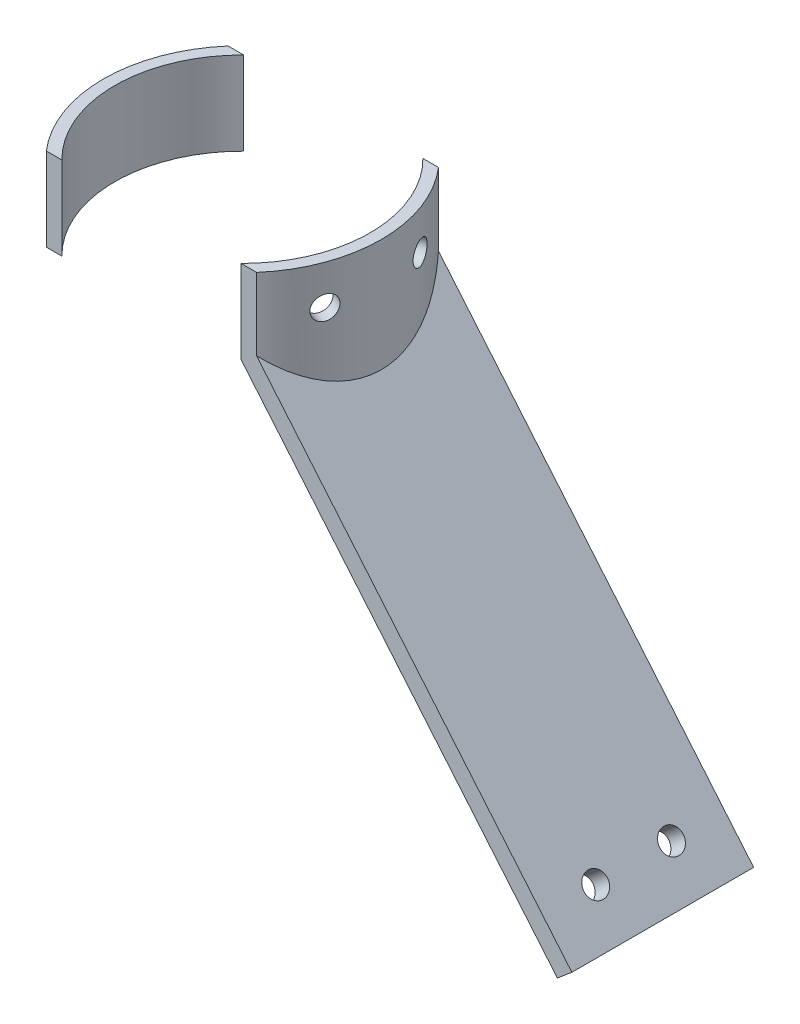
ISO-10303-21;
HEADER;
FILE_DESCRIPTION(('STEP AP214'),'2;1');
FILE_NAME('part.step','',(''),(''),'','','');
FILE_SCHEMA(('AUTOMOTIVE_DESIGN { 1 0 10303 214 1 1 1 1 }'));
ENDSEC;
DATA;
#1=APPLICATION_CONTEXT('core data for automotive mechanical design processes');
#2=APPLICATION_PROTOCOL_DEFINITION('international standard','automotive_design',2000,#1);
#3=PRODUCT_CONTEXT('',#1,'mechanical');
#4=PRODUCT('Part','Part','',(#3));
#5=PRODUCT_RELATED_PRODUCT_CATEGORY('part','',(#4));
#6=PRODUCT_DEFINITION_FORMATION('','',#4);
#7=PRODUCT_DEFINITION_CONTEXT('part definition',#1,'design');
#8=PRODUCT_DEFINITION('design','',#6,#7);
#9=PRODUCT_DEFINITION_SHAPE('','',#8);
#10=(LENGTH_UNIT() NAMED_UNIT(*) SI_UNIT(.MILLI.,.METRE.));
#11=(NAMED_UNIT(*) PLANE_ANGLE_UNIT() SI_UNIT($,.RADIAN.));
#12=(NAMED_UNIT(*) SI_UNIT($,.STERADIAN.) SOLID_ANGLE_UNIT());
#13=UNCERTAINTY_MEASURE_WITH_UNIT(LENGTH_MEASURE(1.E-05),#10,'distance_accuracy_value','');
#14=(GEOMETRIC_REPRESENTATION_CONTEXT(3) GLOBAL_UNCERTAINTY_ASSIGNED_CONTEXT((#13)) GLOBAL_UNIT_ASSIGNED_CONTEXT((#10,
#11,#12)) REPRESENTATION_CONTEXT('',''));
#15=CARTESIAN_POINT('',(0.,0.,0.));
#16=DIRECTION('',(0.,0.,1.));
#17=DIRECTION('',(1.,0.,0.));
#18=AXIS2_PLACEMENT_3D('',#15,#16,#17);
#19=CARTESIAN_POINT('',(0.,2.8,0.));
#20=DIRECTION('',(0.,1.,0.));
#21=DIRECTION('',(0.,0.,1.));
#22=AXIS2_PLACEMENT_3D('',#19,#20,#21);
#23=CYLINDRICAL_SURFACE('',#22,16.85);
#24=DIRECTION('',(0.,1.,0.));
#25=VECTOR('',#24,1.);
#26=CARTESIAN_POINT('',(-11.8288841401038,2.8,-12.));
#27=LINE('',#26,#25);
#28=CARTESIAN_POINT('',(-11.8288841401038,2.8,-12.));
#29=VERTEX_POINT('',#28);
#30=CARTESIAN_POINT('',(-11.8288841401038,13.8,-12.));
#31=VERTEX_POINT('',#30);
#32=EDGE_CURVE('E92',#29,#31,#27,.T.);
#33=ORIENTED_EDGE('',*,*,#32,.T.);
#34=CARTESIAN_POINT('',(0.,13.8,0.));
#35=DIRECTION('',(0.,1.,0.));
#36=DIRECTION('',(0.,0.,1.));
#37=AXIS2_PLACEMENT_3D('',#34,#35,#36);
#38=CIRCLE('',#37,16.85);
#39=CARTESIAN_POINT('',(-11.8288841401038,13.8,12.));
#40=VERTEX_POINT('',#39);
#41=EDGE_CURVE('E12',#31,#40,#38,.T.);
#42=ORIENTED_EDGE('',*,*,#41,.T.);
#43=DIRECTION('',(0.,1.,0.));
#44=VECTOR('',#43,1.);
#45=CARTESIAN_POINT('',(-11.8288841401038,2.8,12.));
#46=LINE('',#45,#44);
#47=CARTESIAN_POINT('',(-11.8288841401038,2.8,12.));
#48=VERTEX_POINT('',#47);
#49=EDGE_CURVE('E63',#48,#40,#46,.T.);
#50=ORIENTED_EDGE('',*,*,#49,.F.);
#51=CARTESIAN_POINT('',(0.,2.8,0.));
#52=DIRECTION('',(0.,1.,0.));
#53=DIRECTION('',(0.,0.,1.));
#54=AXIS2_PLACEMENT_3D('',#51,#52,#53);
#55=CIRCLE('',#54,16.85);
#56=EDGE_CURVE('E104',#29,#48,#55,.T.);
#57=ORIENTED_EDGE('',*,*,#56,.F.);
#58=EDGE_LOOP('',(#33,#42,#50,#57));
#59=FACE_BOUND('',#58,.T.);
#60=ADVANCED_FACE('F48',(#59),#23,.F.);
#61=CARTESIAN_POINT('',(-11.8288841401038,2.8,12.));
#62=DIRECTION('',(0.,0.,-1.));
#63=DIRECTION('',(-1.,0.,0.));
#64=AXIS2_PLACEMENT_3D('',#61,#62,#63);
#65=PLANE('',#64);
#66=ORIENTED_EDGE('',*,*,#49,.T.);
#67=DIRECTION('',(-1.,0.,0.));
#68=VECTOR('',#67,1.);
#69=CARTESIAN_POINT('',(-11.8288841401038,13.8,12.));
#70=LINE('',#69,#68);
#71=CARTESIAN_POINT('',(-13.8824529532788,13.8,12.));
#72=VERTEX_POINT('',#71);
#73=EDGE_CURVE('E56',#40,#72,#70,.T.);
#74=ORIENTED_EDGE('',*,*,#73,.T.);
#75=DIRECTION('',(0.,1.,0.));
#76=VECTOR('',#75,1.);
#77=CARTESIAN_POINT('',(-13.8824529532788,2.8,12.));
#78=LINE('',#77,#76);
#79=CARTESIAN_POINT('',(-13.8824529532788,2.8,12.));
#80=VERTEX_POINT('',#79);
#81=EDGE_CURVE('E71',#80,#72,#78,.T.);
#82=ORIENTED_EDGE('',*,*,#81,.F.);
#83=DIRECTION('',(-1.,0.,0.));
#84=VECTOR('',#83,1.);
#85=CARTESIAN_POINT('',(-11.8288841401038,2.8,12.));
#86=LINE('',#85,#84);
#87=EDGE_CURVE('E106',#48,#80,#86,.T.);
#88=ORIENTED_EDGE('',*,*,#87,.F.);
#89=EDGE_LOOP('',(#66,#74,#82,#88));
#90=FACE_BOUND('',#89,.T.);
#91=ADVANCED_FACE('F118',(#90),#65,.F.);
#92=CARTESIAN_POINT('',(0.,2.8,0.));
#93=DIRECTION('',(0.,1.,0.));
#94=DIRECTION('',(0.,0.,1.));
#95=AXIS2_PLACEMENT_3D('',#92,#93,#94);
#96=CYLINDRICAL_SURFACE('',#95,18.35);
#97=ORIENTED_EDGE('',*,*,#81,.T.);
#98=CARTESIAN_POINT('',(0.,13.8,0.));
#99=DIRECTION('',(0.,1.,0.));
#100=DIRECTION('',(0.,0.,1.));
#101=AXIS2_PLACEMENT_3D('',#98,#99,#100);
#102=CIRCLE('',#101,18.35);
#103=CARTESIAN_POINT('',(-13.8824529532788,13.8,-12.));
#104=VERTEX_POINT('',#103);
#105=EDGE_CURVE('E117',#104,#72,#102,.T.);
#106=ORIENTED_EDGE('',*,*,#105,.F.);
#107=DIRECTION('',(0.,1.,0.));
#108=VECTOR('',#107,1.);
#109=CARTESIAN_POINT('',(-13.8824529532788,2.8,-12.));
#110=LINE('',#109,#108);
#111=CARTESIAN_POINT('',(-13.8824529532788,2.8,-12.));
#112=VERTEX_POINT('',#111);
#113=EDGE_CURVE('E101',#112,#104,#110,.T.);
#114=ORIENTED_EDGE('',*,*,#113,.F.);
#115=CARTESIAN_POINT('',(0.,2.8,0.));
#116=DIRECTION('',(0.,1.,0.));
#117=DIRECTION('',(0.,0.,1.));
#118=AXIS2_PLACEMENT_3D('',#115,#116,#117);
#119=CIRCLE('',#118,18.35);
#120=EDGE_CURVE('E110',#112,#80,#119,.T.);
#121=ORIENTED_EDGE('',*,*,#120,.T.);
#122=EDGE_LOOP('',(#97,#106,#114,#121));
#123=FACE_BOUND('',#122,.T.);
#124=ADVANCED_FACE('F120',(#123),#96,.T.);
#125=CARTESIAN_POINT('',(-11.8288841401038,2.8,-12.));
#126=DIRECTION('',(0.,0.,-1.));
#127=DIRECTION('',(-1.,0.,0.));
#128=AXIS2_PLACEMENT_3D('',#125,#126,#127);
#129=PLANE('',#128);
#130=ORIENTED_EDGE('',*,*,#113,.T.);
#131=DIRECTION('',(-1.,0.,0.));
#132=VECTOR('',#131,1.);
#133=CARTESIAN_POINT('',(-11.8288841401038,13.8,-12.));
#134=LINE('',#133,#132);
#135=EDGE_CURVE('E98',#31,#104,#134,.T.);
#136=ORIENTED_EDGE('',*,*,#135,.F.);
#137=ORIENTED_EDGE('',*,*,#32,.F.);
#138=DIRECTION('',(-1.,0.,0.));
#139=VECTOR('',#138,1.);
#140=CARTESIAN_POINT('',(-11.8288841401038,2.8,-12.));
#141=LINE('',#140,#139);
#142=EDGE_CURVE('E96',#29,#112,#141,.T.);
#143=ORIENTED_EDGE('',*,*,#142,.T.);
#144=EDGE_LOOP('',(#130,#136,#137,#143));
#145=FACE_BOUND('',#144,.T.);
#146=ADVANCED_FACE('F94',(#145),#129,.T.);
#147=CARTESIAN_POINT('',(0.,2.8,0.));
#148=DIRECTION('',(0.,1.,0.));
#149=DIRECTION('',(0.,0.,1.));
#150=AXIS2_PLACEMENT_3D('',#147,#148,#149);
#151=PLANE('',#150);
#152=ORIENTED_EDGE('',*,*,#56,.T.);
#153=ORIENTED_EDGE('',*,*,#87,.T.);
#154=ORIENTED_EDGE('',*,*,#120,.F.);
#155=ORIENTED_EDGE('',*,*,#142,.F.);
#156=EDGE_LOOP('',(#152,#153,#154,#155));
#157=FACE_BOUND('',#156,.T.);
#158=ADVANCED_FACE('F109',(#157),#151,.F.);
#159=CARTESIAN_POINT('',(0.,13.8,0.));
#160=DIRECTION('',(0.,1.,0.));
#161=DIRECTION('',(0.,0.,1.));
#162=AXIS2_PLACEMENT_3D('',#159,#160,#161);
#163=PLANE('',#162);
#164=ORIENTED_EDGE('',*,*,#41,.F.);
#165=ORIENTED_EDGE('',*,*,#135,.T.);
#166=ORIENTED_EDGE('',*,*,#105,.T.);
#167=ORIENTED_EDGE('',*,*,#73,.F.);
#168=EDGE_LOOP('',(#164,#165,#166,#167));
#169=FACE_BOUND('',#168,.T.);
#170=ADVANCED_FACE('F50',(#169),#163,.T.);
#171=CLOSED_SHELL('',(#60,#91,#124,#146,#158,#170));
#172=MANIFOLD_SOLID_BREP('B2_NOT_SHOWN',#171);
#173=CARTESIAN_POINT('',(0.,2.8,0.));
#174=DIRECTION('',(0.,1.,0.));
#175=DIRECTION('',(0.,0.,1.));
#176=AXIS2_PLACEMENT_3D('',#173,#174,#175);
#177=CYLINDRICAL_SURFACE('',#176,16.85);
#178=DIRECTION('',(0.,1.,0.));
#179=VECTOR('',#178,1.);
#180=CARTESIAN_POINT('',(11.8288841401038,2.8,-12.));
#181=LINE('',#180,#179);
#182=CARTESIAN_POINT('',(11.8288841401038,2.8,-12.));
#183=VERTEX_POINT('',#182);
#184=CARTESIAN_POINT('',(11.8288841401038,13.8,-12.));
#185=VERTEX_POINT('',#184);
#186=EDGE_CURVE('E46',#183,#185,#181,.T.);
#187=ORIENTED_EDGE('',*,*,#186,.F.);
#188=CARTESIAN_POINT('',(0.,16.9161808779793,0.));
#189=DIRECTION('',(0.766472000851868,0.642277721791855,0.));
#190=DIRECTION('',(-0.642277721791855,0.766472000851868,0.));
#191=AXIS2_PLACEMENT_3D('',#188,#189,#190);
#192=ELLIPSE('',#191,26.2347570658237,16.85);
#193=CARTESIAN_POINT('',(11.8288841401038,2.8,12.));
#194=VERTEX_POINT('',#193);
#195=EDGE_CURVE('E229',#183,#194,#192,.F.);
#196=ORIENTED_EDGE('',*,*,#195,.T.);
#197=DIRECTION('',(0.,1.,0.));
#198=VECTOR('',#197,1.);
#199=CARTESIAN_POINT('',(11.8288841401038,2.8,12.));
#200=LINE('',#199,#198);
#201=CARTESIAN_POINT('',(11.8288841401038,13.8,12.));
#202=VERTEX_POINT('',#201);
#203=EDGE_CURVE('E234',#194,#202,#200,.T.);
#204=ORIENTED_EDGE('',*,*,#203,.T.);
#205=CARTESIAN_POINT('',(0.,13.8,0.));
#206=DIRECTION('',(0.,1.,0.));
#207=DIRECTION('',(0.,0.,1.));
#208=AXIS2_PLACEMENT_3D('',#205,#206,#207);
#209=CIRCLE('',#208,16.85);
#210=EDGE_CURVE('E318',#202,#185,#209,.T.);
#211=ORIENTED_EDGE('',*,*,#210,.T.);
#212=EDGE_LOOP('',(#187,#196,#204,#211));
#213=FACE_BOUND('',#212,.T.);
#214=CARTESIAN_POINT('',(15.2244260831931,8.6,7.22075830071809));
#215=CARTESIAN_POINT('',(15.2244282672812,8.68685764042173,7.22075507214294));
#216=CARTESIAN_POINT('',(15.2275838402115,8.77377357426321,7.21411201447397));
#217=CARTESIAN_POINT('',(15.2400720108134,8.94519789639456,7.18769158780758));
#218=CARTESIAN_POINT('',(15.249411512842,9.0297034834033,7.16789953787649));
#219=CARTESIAN_POINT('',(15.2738366548366,9.19379940226453,7.11570369449969));
#220=CARTESIAN_POINT('',(15.2889188988741,9.27339260675548,7.08330735426244));
#221=CARTESIAN_POINT('',(15.3241551334922,9.42545551823594,7.00674936291734));
#222=CARTESIAN_POINT('',(15.3443080808927,9.49792668616078,6.96259013164302));
#223=CARTESIAN_POINT('',(15.3888861648403,9.63393822154887,6.86350011211219));
#224=CARTESIAN_POINT('',(15.413323278282,9.69745262658217,6.80853907255129));
#225=CARTESIAN_POINT('',(15.4654228726853,9.81352472045241,6.68935099033785));
#226=CARTESIAN_POINT('',(15.493085500313,9.8660819107552,6.62512352630403));
#227=CARTESIAN_POINT('',(15.5506053147383,9.95884017841085,6.48896281500783));
#228=CARTESIAN_POINT('',(15.5804665780346,9.99901754916391,6.41701513469733));
#229=CARTESIAN_POINT('',(15.6412281860524,10.0657250691206,6.26745474228185));
#230=CARTESIAN_POINT('',(15.672128509321,10.0922554998985,6.18984214709754));
#231=CARTESIAN_POINT('',(15.7338135103264,10.1308426235445,6.03132007004642));
#232=CARTESIAN_POINT('',(15.7645982679686,10.1429400389337,5.95042053326297));
#233=CARTESIAN_POINT('',(15.8251730351182,10.1524424837646,5.78739651330843));
#234=CARTESIAN_POINT('',(15.8549630673501,10.1498478490761,5.70527205818258));
#235=CARTESIAN_POINT('',(15.9126254571186,10.1300732574301,5.54240856480558));
#236=CARTESIAN_POINT('',(15.9405035321067,10.1129390368253,5.46166599125277));
#237=CARTESIAN_POINT('',(15.993778228799,10.0646416546888,5.30363235185331));
#238=CARTESIAN_POINT('',(16.0191748246959,10.0334783472739,5.22634132190712));
#239=CARTESIAN_POINT('',(16.0670173551111,9.95796364802588,5.07736050951955));
#240=CARTESIAN_POINT('',(16.089459238618,9.91359441649133,5.00567847067833));
#241=CARTESIAN_POINT('',(16.1310036466746,9.81294018445009,4.87013903782363));
#242=CARTESIAN_POINT('',(16.1501060896877,9.75665489307182,4.80628183487482));
#243=CARTESIAN_POINT('',(16.184816419517,9.63352077801484,4.68807366928212));
#244=CARTESIAN_POINT('',(16.2004112424264,9.56663399566885,4.63375840412252));
#245=CARTESIAN_POINT('',(16.2278948072455,9.42432772657509,4.5365723835801));
#246=CARTESIAN_POINT('',(16.2397835431455,9.34890822599115,4.49370164675545));
#247=CARTESIAN_POINT('',(16.2598020406441,9.19164153355043,4.42072132312091));
#248=CARTESIAN_POINT('',(16.2679308198675,9.10979266840137,4.39061507149747));
#249=CARTESIAN_POINT('',(16.2804057707325,8.94201052152151,4.344130786106));
#250=CARTESIAN_POINT('',(16.2847520360558,8.8560773410028,4.32775241233915));
#251=CARTESIAN_POINT('',(16.2896501562254,8.68288949426581,4.30927958967893));
#252=CARTESIAN_POINT('',(16.2902153053212,8.59564054021511,4.3071350952608));
#253=CARTESIAN_POINT('',(16.2875863780914,8.42201374659574,4.31706559175274));
#254=CARTESIAN_POINT('',(16.2843923430773,8.33563589746461,4.32914042639972));
#255=CARTESIAN_POINT('',(16.2742555388917,8.16635400686564,4.36709140780127));
#256=CARTESIAN_POINT('',(16.2673192094256,8.08344426083319,4.39294384525489));
#257=CARTESIAN_POINT('',(16.2497139919301,7.92327499987572,4.45762403434126));
#258=CARTESIAN_POINT('',(16.2390450328075,7.84601559260335,4.49645203311142));
#259=CARTESIAN_POINT('',(16.2139800264284,7.69910252466562,4.5860126365565));
#260=CARTESIAN_POINT('',(16.1995736241677,7.62947077194627,4.63677827864595));
#261=CARTESIAN_POINT('',(16.1671446163227,7.50001166074627,4.74861198206451));
#262=CARTESIAN_POINT('',(16.1491219381915,7.44018449900148,4.80968025007301));
#263=CARTESIAN_POINT('',(16.1095875611131,7.33185760509499,4.94048187302096));
#264=CARTESIAN_POINT('',(16.0880659131974,7.28339116484657,5.01023979985773));
#265=CARTESIAN_POINT('',(16.0418798490824,7.19939084777889,5.15620428427038));
#266=CARTESIAN_POINT('',(16.0172154717735,7.16385681094603,5.23241076204347));
#267=CARTESIAN_POINT('',(15.9652451355783,7.10679117032993,5.38889864567805));
#268=CARTESIAN_POINT('',(15.9379434532105,7.08523732077257,5.4691733574452));
#269=CARTESIAN_POINT('',(15.8812898949251,7.05666961334635,5.63156486743939));
#270=CARTESIAN_POINT('',(15.8519380663803,7.04965541962316,5.71368162307241));
#271=CARTESIAN_POINT('',(15.792081658912,7.05036938784146,5.87709124674859));
#272=CARTESIAN_POINT('',(15.761581632166,7.05804433267079,5.95838602026259));
#273=CARTESIAN_POINT('',(15.7002515926462,7.08780625160656,6.11816357531452));
#274=CARTESIAN_POINT('',(15.6694215792279,7.10989325387291,6.19664635135774));
#275=CARTESIAN_POINT('',(15.6084576160425,7.16784149958837,6.34864252720809));
#276=CARTESIAN_POINT('',(15.5783237008364,7.20370342540402,6.42215568062348));
#277=CARTESIAN_POINT('',(15.5198375590157,7.28817722561959,6.56223364886247));
#278=CARTESIAN_POINT('',(15.4914853141662,7.33678896950273,6.62879853480402));
#279=CARTESIAN_POINT('',(15.4375491787496,7.44559125262322,6.75345932616305));
#280=CARTESIAN_POINT('',(15.4119756800651,7.50582306592314,6.81152370488593));
#281=CARTESIAN_POINT('',(15.3647494464856,7.63607680558096,6.91739433296635));
#282=CARTESIAN_POINT('',(15.3430976573798,7.70610108636848,6.96519810831167));
#283=CARTESIAN_POINT('',(15.3046037119646,7.8541128089387,7.04938004501614));
#284=CARTESIAN_POINT('',(15.2877719634385,7.93211699623317,7.08573349865082));
#285=CARTESIAN_POINT('',(15.259744630174,8.09370145284663,7.14589430712018));
#286=CARTESIAN_POINT('',(15.2485426196699,8.17727524101753,7.16971596716537));
#287=CARTESIAN_POINT('',(15.2351095978662,8.31777745610907,7.19819976359607));
#288=CARTESIAN_POINT('',(15.2311113496279,8.37380426440338,7.20664877394122));
#289=CARTESIAN_POINT('',(15.225768883611,8.48654575818663,7.21792908709413));
#290=CARTESIAN_POINT('',(15.2244246564425,8.5432604412411,7.22076040977757));
#291=CARTESIAN_POINT('',(15.2244260831931,8.6,7.22075830071809));
#292=B_SPLINE_CURVE_WITH_KNOTS('',3,(#214,#215,#216,#217,#218,#219,#220,#221,#222,#223,#224,
#225,#226,#227,#228,#229,#230,#231,#232,#233,#234,#235,#236,#237,#238,#239,#240,#241,#242,#243,
#244,#245,#246,#247,#248,#249,#250,#251,#252,#253,#254,#255,#256,#257,#258,#259,#260,#261,#262,
#263,#264,#265,#266,#267,#268,#269,#270,#271,#272,#273,#274,#275,#276,#277,#278,#279,#280,#281,
#282,#283,#284,#285,#286,#287,#288,#289,#290,#291),.UNSPECIFIED.,.T.,.F.,(4,2,2,2,2,2,2,2,2,2,2,
2,2,2,2,2,2,2,2,2,2,2,2,2,2,2,2,2,2,2,2,2,2,2,2,2,2,2,4),(0.,0.260365714642252,0.52102261890889,
0.781525624404935,1.04197508118343,1.30316461678478,1.56436603346214,1.82606457022622,
2.08775770720575,2.34871072173607,2.60965777073196,2.86978700330242,3.12991894092079,
3.39040389458143,3.65089520742494,3.91234120445754,4.17378762544189,4.43530231678541,
4.69681053099423,4.95739880764163,5.2179842205851,5.47812264415891,5.73826602270955,
5.99913800148197,6.26001521418955,6.52164761260898,6.78327677372093,7.04448859312948,
7.30569437868802,7.56595563580761,7.82621740145645,8.08649206132053,8.34676405692056,
8.60797814096131,8.86925513774164,9.13109212070597,9.39262956109941,9.5627134818814,
9.73279680089649),.UNSPECIFIED.);
#293=CARTESIAN_POINT('',(15.2244260831931,8.6,7.22075830071809));
#294=VERTEX_POINT('',#293);
#295=EDGE_CURVE('E266',#294,#294,#292,.T.);
#296=ORIENTED_EDGE('',*,*,#295,.F.);
#297=EDGE_LOOP('',(#296));
#298=FACE_BOUND('',#297,.T.);
#299=CARTESIAN_POINT('',(16.2895902531871,8.6,-4.30949525852744));
#300=CARTESIAN_POINT('',(16.2895898396474,8.68687485213427,-4.30949912832715));
#301=CARTESIAN_POINT('',(16.287712985253,8.77380799662305,-4.31661065111521));
#302=CARTESIAN_POINT('',(16.2802009208052,8.94526676155865,-4.3448548058642));
#303=CARTESIAN_POINT('',(16.2745615104448,9.02978958117154,-4.3660031075626));
#304=CARTESIAN_POINT('',(16.2595319234897,9.19391997965849,-4.42164529445931));
#305=CARTESIAN_POINT('',(16.2501439296771,9.27353038791383,-4.45613141274487));
#306=CARTESIAN_POINT('',(16.2276477361407,9.42562493567571,-4.53736893563135));
#307=CARTESIAN_POINT('',(16.2145403056979,9.49811054461535,-4.58411780381035));
#308=CARTESIAN_POINT('',(16.1846380432556,9.63413336575868,-4.68859713235003));
#309=CARTESIAN_POINT('',(16.1678334854355,9.69764623635131,-4.74635650286123));
#310=CARTESIAN_POINT('',(16.1307074100592,9.8137109754555,-4.87103690844595));
#311=CARTESIAN_POINT('',(16.1103857380967,9.86626236251848,-4.9379583457206));
#312=CARTESIAN_POINT('',(16.0664509936563,9.95899097011073,-5.0790860250181));
#313=CARTESIAN_POINT('',(16.0428325881427,9.99914779536376,-5.15330401177221));
#314=CARTESIAN_POINT('',(15.9927348504119,10.0658159286408,-5.30673513211479));
#315=CARTESIAN_POINT('',(15.9662555787895,10.0923275256101,-5.38594815989058));
#316=CARTESIAN_POINT('',(15.911083667811,10.1308798248977,-5.54681190508084));
#317=CARTESIAN_POINT('',(15.8823975980632,10.1429618350789,-5.62845497491297));
#318=CARTESIAN_POINT('',(15.8234765172783,10.1524409405187,-5.79203304365329));
#319=CARTESIAN_POINT('',(15.7932415397342,10.1498383531799,-5.8739680362134));
#320=CARTESIAN_POINT('',(15.7321947269102,10.1300555807298,-6.03556042824462));
#321=CARTESIAN_POINT('',(15.7013848290229,10.1129178908692,-6.11522376814324));
#322=CARTESIAN_POINT('',(15.6400967130267,10.0646187054545,-6.27031355368401));
#323=CARTESIAN_POINT('',(15.6096184989417,10.0334570399617,-6.34573994797162));
#324=CARTESIAN_POINT('',(15.5500136382739,9.9579406731822,-6.49043257784792));
#325=CARTESIAN_POINT('',(15.5208892778031,9.91356453127814,-6.55968856279635));
#326=CARTESIAN_POINT('',(15.4651391673346,9.81289455878253,-6.69006770669231));
#327=CARTESIAN_POINT('',(15.4385134801821,9.75660042855136,-6.75119066109792));
#328=CARTESIAN_POINT('',(15.3887260368936,9.63344123198333,-6.86392240768664));
#329=CARTESIAN_POINT('',(15.3655776073948,9.56653742024266,-6.91549476437347));
#330=CARTESIAN_POINT('',(15.323837696498,9.42419246865494,-7.00750018327498));
#331=CARTESIAN_POINT('',(15.3052462177587,9.34875132382676,-7.04793323899035));
#332=CARTESIAN_POINT('',(15.2734341798062,9.19145281909122,-7.11661070511637));
#333=CARTESIAN_POINT('',(15.2602139669112,9.10959504587053,-7.14485432960745));
#334=CARTESIAN_POINT('',(15.2397463802147,8.94179430364453,-7.18840834278278));
#335=CARTESIAN_POINT('',(15.2324988472913,8.85585144353721,-7.20371907602091));
#336=CARTESIAN_POINT('',(15.2243279957652,8.68267011724502,-7.2209715147604));
#337=CARTESIAN_POINT('',(15.2233807259162,8.59543782280455,-7.22296385197485));
#338=CARTESIAN_POINT('',(15.2277907446617,8.42184637812954,-7.21366165689065));
#339=CARTESIAN_POINT('',(15.2331479587511,8.33548721758864,-7.20236728161165));
#340=CARTESIAN_POINT('',(15.2499035698212,8.16625318908284,-7.16682091827444));
#341=CARTESIAN_POINT('',(15.2612909658147,8.08337227188709,-7.14259252536582));
#342=CARTESIAN_POINT('',(15.2895851831166,7.92325977681206,-7.08182192803297));
#343=CARTESIAN_POINT('',(15.3064921142665,7.846028311397,-7.04527947855269));
#344=CARTESIAN_POINT('',(15.3451416191757,7.69915442713193,-6.96069601198073));
#345=CARTESIAN_POINT('',(15.3668984404136,7.62953528807432,-6.912621083679));
#346=CARTESIAN_POINT('',(15.4142964663532,7.50009768757522,-6.80627246196407));
#347=CARTESIAN_POINT('',(15.4399377559001,7.44027944026589,-6.74799854577852));
#348=CARTESIAN_POINT('',(15.4941534146465,7.33194855606896,-6.62256626811167));
#349=CARTESIAN_POINT('',(15.522736861891,7.28347251873752,-6.55538021219656));
#350=CARTESIAN_POINT('',(15.5816646974969,7.19945297824665,-6.41405322319526));
#351=CARTESIAN_POINT('',(15.6120090659275,7.16390932874676,-6.33991236882021));
#352=CARTESIAN_POINT('',(15.6733138678587,7.10682141700697,-6.18680184361074));
#353=CARTESIAN_POINT('',(15.704273334434,7.08525673645729,-6.10783940084695));
#354=CARTESIAN_POINT('',(15.7658148344459,7.05667385736885,-5.9471824010183));
#355=CARTESIAN_POINT('',(15.7963968768676,7.04965531187199,-5.8654879091662));
#356=CARTESIAN_POINT('',(15.8561434686138,7.05036944188681,-5.70199625033251));
#357=CARTESIAN_POINT('',(15.8853129202323,7.05804669166649,-5.62020062731963));
#358=CARTESIAN_POINT('',(15.9415841018395,7.0878197626115,-5.45854596003213));
#359=CARTESIAN_POINT('',(15.9686858313388,7.10991558719031,-5.37868691621599));
#360=CARTESIAN_POINT('',(16.0202050676513,7.16788052453857,-5.2232402222843));
#361=CARTESIAN_POINT('',(16.0446232084379,7.20374637522975,-5.14765156538818));
#362=CARTESIAN_POINT('',(16.0903362076972,7.28822764738427,-5.00293380328834));
#363=CARTESIAN_POINT('',(16.1116311019138,7.33684292291923,-4.93380462416248));
#364=CARTESIAN_POINT('',(16.1508668345379,7.44564224372941,-4.80381454142901));
#365=CARTESIAN_POINT('',(16.1687958133781,7.50586573366287,-4.74298307264295));
#366=CARTESIAN_POINT('',(16.2010300255624,7.63609716281863,-4.63168359673742));
#367=CARTESIAN_POINT('',(16.2153343837067,7.70610745883967,-4.5812180931363));
#368=CARTESIAN_POINT('',(16.2402468681767,7.8540938535798,-4.49210795883202));
#369=CARTESIAN_POINT('',(16.2508465741222,7.93208758488942,-4.4534902813087));
#370=CARTESIAN_POINT('',(16.2682563681381,8.09364740987073,-4.38946984918477));
#371=CARTESIAN_POINT('',(16.2750707679594,8.17720704150035,-4.36405206106714));
#372=CARTESIAN_POINT('',(16.2831915197748,8.31770783881584,-4.33362646012958));
#373=CARTESIAN_POINT('',(16.2855904790913,8.37374851532424,-4.32459041539223));
#374=CARTESIAN_POINT('',(16.2887899782511,8.48651783685086,-4.31252356042266));
#375=CARTESIAN_POINT('',(16.289590523344,8.54324647960906,-4.30949273046839));
#376=CARTESIAN_POINT('',(16.2895902531871,8.6,-4.30949525852744));
#377=B_SPLINE_CURVE_WITH_KNOTS('',3,(#299,#300,#301,#302,#303,#304,#305,#306,#307,#308,#309,
#310,#311,#312,#313,#314,#315,#316,#317,#318,#319,#320,#321,#322,#323,#324,#325,#326,#327,#328,
#329,#330,#331,#332,#333,#334,#335,#336,#337,#338,#339,#340,#341,#342,#343,#344,#345,#346,#347,
#348,#349,#350,#351,#352,#353,#354,#355,#356,#357,#358,#359,#360,#361,#362,#363,#364,#365,#366,
#367,#368,#369,#370,#371,#372,#373,#374,#375,#376),.UNSPECIFIED.,.T.,.F.,(4,2,2,2,2,2,2,2,2,2,2,
2,2,2,2,2,2,2,2,2,2,2,2,2,2,2,2,2,2,2,2,2,2,2,2,2,2,2,4),(0.,0.260417342922058,
0.521125888705286,0.781682846024832,1.04218595229338,1.30338272234711,1.56459096223012,
1.82622675711418,2.08785701148477,2.34873648261141,2.60961031493967,2.8697240676229,
3.12984097237456,3.39038224047634,3.65093005983108,3.91245226443384,4.17397462162346,
4.43551383807741,4.69704608646891,4.95758351583458,5.21811786625319,5.47817854758008,
5.7382444045541,5.99908456594359,6.25993042547005,6.52160673035626,6.7832800740705,
7.04457033954591,7.30585437258788,7.56615490457169,7.82645549817934,8.08669446536035,
8.34693045400763,8.60806682946414,8.86926619886348,9.13105545068036,9.39254588996603,
9.56267164163423,9.73279683458235),.UNSPECIFIED.);
#378=CARTESIAN_POINT('',(16.2895902531871,8.6,-4.30949525852744));
#379=VERTEX_POINT('',#378);
#380=EDGE_CURVE('E267',#379,#379,#377,.T.);
#381=ORIENTED_EDGE('',*,*,#380,.F.);
#382=EDGE_LOOP('',(#381));
#383=FACE_BOUND('',#382,.T.);
#384=ADVANCED_FACE('F171',(#213,#298,#383),#177,.F.);
#385=CARTESIAN_POINT('',(0.,2.8,0.));
#386=DIRECTION('',(0.,1.,0.));
#387=DIRECTION('',(0.,0.,1.));
#388=AXIS2_PLACEMENT_3D('',#385,#386,#387);
#389=CYLINDRICAL_SURFACE('',#388,18.35);
#390=CARTESIAN_POINT('',(16.6396770829419,8.6,7.73586753864213));
#391=CARTESIAN_POINT('',(16.639679202655,8.68689006010429,7.73586427113246));
#392=CARTESIAN_POINT('',(16.6427834128647,8.77383917299983,7.72919672986814));
#393=CARTESIAN_POINT('',(16.6550723346045,8.94533111315634,7.70267945792706));
#394=CARTESIAN_POINT('',(16.6642639244864,9.02987110542524,7.68281481528546));
#395=CARTESIAN_POINT('',(16.6883151200536,9.19403601268551,7.63043014073682));
#396=CARTESIAN_POINT('',(16.7031714767887,9.2736637146973,7.59791736278006));
#397=CARTESIAN_POINT('',(16.7379042293069,9.42578888578478,7.52109238071147));
#398=CARTESIAN_POINT('',(16.7577795589805,9.49828786457615,7.47678268234433));
#399=CARTESIAN_POINT('',(16.8017716274519,9.63431354806488,7.37739262765934));
#400=CARTESIAN_POINT('',(16.8258984803146,9.69781819117057,7.32228655178498));
#401=CARTESIAN_POINT('',(16.8773872406011,9.81386326844851,7.20281350364395));
#402=CARTESIAN_POINT('',(16.9047492918525,9.86640321487428,7.13844611961832));
#403=CARTESIAN_POINT('',(16.9617006417752,9.95910471775755,7.00204782084553));
#404=CARTESIAN_POINT('',(16.9912934330544,9.99924633980642,6.93000481250935));
#405=CARTESIAN_POINT('',(17.0515878162673,10.0658850778957,6.78029191098775));
#406=CARTESIAN_POINT('',(17.0822893885698,10.0923824353853,6.70262211740174));
#407=CARTESIAN_POINT('',(17.1436823359407,10.1309186442176,6.54399479305321));
#408=CARTESIAN_POINT('',(17.1743735604447,10.1429918543922,6.46304555198827));
#409=CARTESIAN_POINT('',(17.2348629654496,10.1524422686821,6.29996513143393));
#410=CARTESIAN_POINT('',(17.2646611634193,10.1498197604553,6.21783397511105));
#411=CARTESIAN_POINT('',(17.3224549372021,10.129981467901,6.0549570636342));
#412=CARTESIAN_POINT('',(17.3504550692011,10.1128042720051,5.9742082205825));
#413=CARTESIAN_POINT('',(17.4040590747476,10.0644032128888,5.81620087406118));
#414=CARTESIAN_POINT('',(17.4296629267097,10.0331792231509,5.73894240203575));
#415=CARTESIAN_POINT('',(17.4779768594277,9.95753370815051,5.5900771753906));
#416=CARTESIAN_POINT('',(17.5006835782096,9.9130970457885,5.51847702296535));
#417=CARTESIAN_POINT('',(17.542789442091,9.81229847144919,5.38312830282219));
#418=CARTESIAN_POINT('',(17.562188519236,9.75593631451927,5.31937989642364));
#419=CARTESIAN_POINT('',(17.5974799649281,9.63267931644149,5.20144289339662));
#420=CARTESIAN_POINT('',(17.6133613097393,9.56575245963825,5.14728445289233));
#421=CARTESIAN_POINT('',(17.641384159402,9.42337758355785,5.05040753663407));
#422=CARTESIAN_POINT('',(17.6535256594284,9.34792955328674,5.00768907564011));
#423=CARTESIAN_POINT('',(17.6739848241847,9.19062465032428,4.93499683076047));
#424=CARTESIAN_POINT('',(17.6823016848429,9.10876643421904,4.90502572691053));
#425=CARTESIAN_POINT('',(17.6950656861048,8.94098099134504,4.85877875252912));
#426=CARTESIAN_POINT('',(17.6995129073131,8.85505384937129,4.84250259673228));
#427=CARTESIAN_POINT('',(17.7045138916237,8.68184265906521,4.8241869301997));
#428=CARTESIAN_POINT('',(17.7050791689344,8.5945633938067,4.82210531725312));
#429=CARTESIAN_POINT('',(17.7023449921644,8.42088580443341,4.83213283442619));
#430=CARTESIAN_POINT('',(17.6990455737901,8.334487472187,4.84424183343689));
#431=CARTESIAN_POINT('',(17.6886010866345,8.16515057118651,4.88224077078629));
#432=CARTESIAN_POINT('',(17.6814615519151,8.08220720828811,4.90811087715027));
#433=CARTESIAN_POINT('',(17.66337266836,7.92198611693467,4.97281488670096));
#434=CARTESIAN_POINT('',(17.6524232581238,7.8447084798134,5.01164899881666));
#435=CARTESIAN_POINT('',(17.6267536557437,7.69781173988887,5.10119809057113));
#436=CARTESIAN_POINT('',(17.612024603457,7.62821118927228,5.15194096221853));
#437=CARTESIAN_POINT('',(17.5789394588876,7.49883209996316,5.26372264448884));
#438=CARTESIAN_POINT('',(17.5605833052058,7.43905372757045,5.32476162940033));
#439=CARTESIAN_POINT('',(17.5204159357136,7.33086876760988,5.45547455737258));
#440=CARTESIAN_POINT('',(17.4985964213743,7.28249020499213,5.52516915049791));
#441=CARTESIAN_POINT('',(17.451877346381,7.19867098424906,5.67100802799369));
#442=CARTESIAN_POINT('',(17.4269778185769,7.16323018815181,5.7471522435729));
#443=CARTESIAN_POINT('',(17.3746208800674,7.10634432960568,5.90354421828506));
#444=CARTESIAN_POINT('',(17.3471669832635,7.08488035607505,5.98378627361372));
#445=CARTESIAN_POINT('',(17.2903141026273,7.05649426527747,6.146131451789));
#446=CARTESIAN_POINT('',(17.2609151561099,7.04957186912008,6.22823453891267));
#447=CARTESIAN_POINT('',(17.2010576086374,7.05046784088741,6.3916875380565));
#448=CARTESIAN_POINT('',(17.1706025117197,7.05824133039536,6.47303898321306));
#449=CARTESIAN_POINT('',(17.1094651265498,7.08821379746057,6.63295059087092));
#450=CARTESIAN_POINT('',(17.0787828378308,7.11041280467111,6.71151074763406));
#451=CARTESIAN_POINT('',(17.0182013180408,7.16859752297682,6.86367512494075));
#452=CARTESIAN_POINT('',(16.9883021330186,7.2045840428825,6.93727905444155));
#453=CARTESIAN_POINT('',(16.9303492807921,7.28931674467313,7.0775376147784));
#454=CARTESIAN_POINT('',(16.9022955865026,7.33806273924136,7.14419234761274));
#455=CARTESIAN_POINT('',(16.849007525729,7.44710666852319,7.26898004158181));
#456=CARTESIAN_POINT('',(16.8237819944944,7.50743929033901,7.3270864649132));
#457=CARTESIAN_POINT('',(16.7772483020791,7.63788036973813,7.43302068287281));
#458=CARTESIAN_POINT('',(16.7559410898392,7.70799118820085,7.48084598808643));
#459=CARTESIAN_POINT('',(16.7181038776042,7.8561346881259,7.56502765060195));
#460=CARTESIAN_POINT('',(16.7015828574927,7.93418189412064,7.60136246091045));
#461=CARTESIAN_POINT('',(16.674103032435,8.09582419390864,7.66145482214141));
#462=CARTESIAN_POINT('',(16.66313783464,8.17941278559464,7.68522682990841));
#463=CARTESIAN_POINT('',(16.6500462155239,8.31957814400469,7.71353363900705));
#464=CARTESIAN_POINT('',(16.6461653574306,8.3752532875257,7.72189855855515));
#465=CARTESIAN_POINT('',(16.6409801072209,8.48727733621943,7.73306656033444));
#466=CARTESIAN_POINT('',(16.6396757076845,8.5436262394513,7.73586965858321));
#467=CARTESIAN_POINT('',(16.6396770829419,8.6,7.73586753864213));
#468=B_SPLINE_CURVE_WITH_KNOTS('',3,(#390,#391,#392,#393,#394,#395,#396,#397,#398,#399,#400,
#401,#402,#403,#404,#405,#406,#407,#408,#409,#410,#411,#412,#413,#414,#415,#416,#417,#418,#419,
#420,#421,#422,#423,#424,#425,#426,#427,#428,#429,#430,#431,#432,#433,#434,#435,#436,#437,#438,
#439,#440,#441,#442,#443,#444,#445,#446,#447,#448,#449,#450,#451,#452,#453,#454,#455,#456,#457,
#458,#459,#460,#461,#462,#463,#464,#465,#466,#467),.UNSPECIFIED.,.T.,.F.,(4,2,2,2,2,2,2,2,2,2,2,
2,2,2,2,2,2,2,2,2,2,2,2,2,2,2,2,2,2,2,2,2,2,2,2,2,2,2,4),(0.,0.260464328268042,
0.521223467941043,0.781833277157962,1.04238777521261,1.30357069399148,1.56476522858741,
1.82637755957293,2.08798526090434,2.34896855296318,2.60994673648345,2.8702351531725,
3.13052591428938,3.39111603412209,3.65171150706021,3.91311241991944,4.17451367004019,
4.43596985066912,4.69742058503861,4.95809549587274,5.21876799831594,5.47906584342631,
5.73936788372038,6.00028578234599,6.26120809813125,6.52276531711411,6.78431974669657,
7.04551954548271,7.30671433471654,7.56711277337125,7.82751174730573,8.08792599924454,
8.34833642836094,8.60953896085605,8.87080466846642,9.13255743604801,9.39400832792823,
9.56299654064981,9.73198426669856),.UNSPECIFIED.);
#469=CARTESIAN_POINT('',(16.6396770829419,8.6,7.73586753864213));
#470=VERTEX_POINT('',#469);
#471=EDGE_CURVE('E260',#470,#470,#468,.T.);
#472=ORIENTED_EDGE('',*,*,#471,.T.);
#473=EDGE_LOOP('',(#472));
#474=FACE_BOUND('',#473,.T.);
#475=CARTESIAN_POINT('',(0.,20.8085780687544,0.));
#476=DIRECTION('',(0.766472000851868,0.642277721791855,0.));
#477=DIRECTION('',(-0.642277721791855,0.766472000851868,0.));
#478=AXIS2_PLACEMENT_3D('',#475,#476,#477);
#479=ELLIPSE('',#478,28.5701953802887,18.35);
#480=CARTESIAN_POINT('',(13.8824529532788,4.24173925306857,-12.));
#481=VERTEX_POINT('',#480);
#482=CARTESIAN_POINT('',(13.8824529532788,4.24173925306857,12.));
#483=VERTEX_POINT('',#482);
#484=EDGE_CURVE('E316',#481,#483,#479,.F.);
#485=ORIENTED_EDGE('',*,*,#484,.F.);
#486=DIRECTION('',(0.,1.,0.));
#487=VECTOR('',#486,1.);
#488=CARTESIAN_POINT('',(13.8824529532788,2.8,-12.));
#489=LINE('',#488,#487);
#490=CARTESIAN_POINT('',(13.8824529532788,13.8,-12.));
#491=VERTEX_POINT('',#490);
#492=EDGE_CURVE('E185',#481,#491,#489,.T.);
#493=ORIENTED_EDGE('',*,*,#492,.T.);
#494=CARTESIAN_POINT('',(0.,13.8,0.));
#495=DIRECTION('',(0.,1.,0.));
#496=DIRECTION('',(0.,0.,1.));
#497=AXIS2_PLACEMENT_3D('',#494,#495,#496);
#498=CIRCLE('',#497,18.35);
#499=CARTESIAN_POINT('',(13.8824529532788,13.8,12.));
#500=VERTEX_POINT('',#499);
#501=EDGE_CURVE('E257',#500,#491,#498,.T.);
#502=ORIENTED_EDGE('',*,*,#501,.F.);
#503=DIRECTION('',(0.,1.,0.));
#504=VECTOR('',#503,1.);
#505=CARTESIAN_POINT('',(13.8824529532788,2.8,12.));
#506=LINE('',#505,#504);
#507=EDGE_CURVE('E253',#483,#500,#506,.T.);
#508=ORIENTED_EDGE('',*,*,#507,.F.);
#509=EDGE_LOOP('',(#485,#493,#502,#508));
#510=FACE_BOUND('',#509,.T.);
#511=CARTESIAN_POINT('',(17.7044375573001,8.6,-4.82445756325635));
#512=CARTESIAN_POINT('',(17.7044370703041,8.6869045677698,-4.82446142230332));
#513=CARTESIAN_POINT('',(17.7025071665582,8.77386818729688,-4.83155894761387));
#514=CARTESIAN_POINT('',(17.6947883126968,8.94538915854262,-4.85975019041073));
#515=CARTESIAN_POINT('',(17.6889949976668,9.02994367563995,-4.88085973867266));
#516=CARTESIAN_POINT('',(17.6735735860026,9.19413764402489,-4.93640786339564));
#517=CARTESIAN_POINT('',(17.6639476582829,9.27377984585152,-4.97083890077978));
#518=CARTESIAN_POINT('',(17.6409176973838,9.42593167736002,-5.05195922264254));
#519=CARTESIAN_POINT('',(17.6275144700754,9.49844282397629,-5.09864589228783));
#520=CARTESIAN_POINT('',(17.5970006468379,9.63447799655017,-5.20298187976686));
#521=CARTESIAN_POINT('',(17.5798817364398,9.69798133033948,-5.26065574733014));
#522=CARTESIAN_POINT('',(17.5421403249734,9.81402017732059,-5.38516814392274));
#523=CARTESIAN_POINT('',(17.5215176727666,9.86655521716261,-5.45200706827486));
#524=CARTESIAN_POINT('',(17.4770344761355,9.9592317107314,-5.59296226024386));
#525=CARTESIAN_POINT('',(17.4531695177175,9.99935602047862,-5.66708840980616));
#526=CARTESIAN_POINT('',(17.4026577095057,10.0659615738448,-5.8203529200872));
#527=CARTESIAN_POINT('',(17.3760109102206,10.092443065119,-5.89949118979268));
#528=CARTESIAN_POINT('',(17.3205906463368,10.1309499367399,-6.06026802543446));
#529=CARTESIAN_POINT('',(17.2918224879974,10.1430101691323,-6.14190007249069));
#530=CARTESIAN_POINT('',(17.2328424874908,10.1524409262123,-6.30548954663758));
#531=CARTESIAN_POINT('',(17.2026306720817,10.1498117230625,-6.38744696767166));
#532=CARTESIAN_POINT('',(17.1417183634462,10.1299665449453,-6.54915573003604));
#533=CARTESIAN_POINT('',(17.11101925333,10.11278642657,-6.62891199706578));
#534=CARTESIAN_POINT('',(17.0500417176885,10.0643838538184,-6.78421267004097));
#535=CARTESIAN_POINT('',(17.0197632965685,10.0331612525088,-6.8597570319059));
#536=CARTESIAN_POINT('',(16.960633853475,9.9575143189596,-7.00467983211837));
#537=CARTESIAN_POINT('',(16.9317848612291,9.91307180822165,-7.07404960811319));
#538=CARTESIAN_POINT('',(16.8766249730783,9.81225990369511,-7.20465567210277));
#539=CARTESIAN_POINT('',(16.8503141308726,9.75589025764697,-7.2658917880256));
#540=CARTESIAN_POINT('',(16.8011793334085,9.63261205932399,-7.37879966372974));
#541=CARTESIAN_POINT('',(16.7783666348621,9.56567083550991,-7.43044065562441));
#542=CARTESIAN_POINT('',(16.737266042699,9.42326333169829,-7.52256460184711));
#543=CARTESIAN_POINT('',(16.7189781509458,9.3477970481899,-7.56304755157993));
#544=CARTESIAN_POINT('',(16.6877085923138,9.19046536901794,-7.631796338318));
#545=CARTESIAN_POINT('',(16.6747271581225,9.10859969292932,-7.66006163958412));
#546=CARTESIAN_POINT('',(16.6546452496528,8.94079868615827,-7.70362720507862));
#547=CARTESIAN_POINT('',(16.6475446436424,8.8548634466807,-7.71892775972084));
#548=CARTESIAN_POINT('',(16.6395569937791,8.6816578426671,-7.73613175389072));
#549=CARTESIAN_POINT('',(16.6386500894171,8.59439264574006,-7.73807801492777));
#550=CARTESIAN_POINT('',(16.6430380949039,8.42074490304117,-7.72863565071621));
#551=CARTESIAN_POINT('',(16.6483329431068,8.33436234850439,-7.71724715801618));
#552=CARTESIAN_POINT('',(16.6648733952642,8.16506580685817,-7.68146329030851));
#553=CARTESIAN_POINT('',(16.6761099212163,8.08214673602625,-7.65708775714334));
#554=CARTESIAN_POINT('',(16.7040330596374,7.92197347084081,-7.59597929795165));
#555=CARTESIAN_POINT('',(16.7207197638992,7.84471937192457,-7.55924616379594));
#556=CARTESIAN_POINT('',(16.7588769485091,7.6978555985204,-7.47426985698078));
#557=CARTESIAN_POINT('',(16.78035935405,7.62826563762851,-7.42599797002085));
#558=CARTESIAN_POINT('',(16.827193608434,7.49890459149717,-7.31925156598499));
#559=CARTESIAN_POINT('',(16.8525455286016,7.43913368728826,-7.26077686084421));
#560=CARTESIAN_POINT('',(16.9061854726247,7.3309452897278,-7.13498922409468));
#561=CARTESIAN_POINT('',(16.9344811738013,7.2825586138419,-7.0676530544897));
#562=CARTESIAN_POINT('',(16.9928802302584,7.19872315700767,-6.92606511335318));
#563=CARTESIAN_POINT('',(17.0229835678587,7.16327424954148,-6.85181340945726));
#564=CARTESIAN_POINT('',(17.0838867269707,7.10636964458314,-6.69851495248184));
#565=CARTESIAN_POINT('',(17.1146856341323,7.08489657027753,-6.61947428798858));
#566=CARTESIAN_POINT('',(17.1759978832959,7.05649775972737,-6.45871457393194));
#567=CARTESIAN_POINT('',(17.2065112309431,7.04957173528495,-6.37699557746272));
#568=CARTESIAN_POINT('',(17.2662380120638,7.05046792164051,-6.2134595255709));
#569=CARTESIAN_POINT('',(17.2954552643755,7.05824338718593,-6.13164360482032));
#570=CARTESIAN_POINT('',(17.3519146465172,7.08822532044811,-5.9699991868876));
#571=CARTESIAN_POINT('',(17.3791567751606,7.11043179683405,-5.89017069089939));
#572=CARTESIAN_POINT('',(17.4310344706027,7.16863060478376,-5.73482760722659));
#573=CARTESIAN_POINT('',(17.4556705136337,7.20462041202802,-5.65931223253272));
#574=CARTESIAN_POINT('',(17.5018692336584,7.28935934063981,-5.51478347226349));
#575=CARTESIAN_POINT('',(17.5234319588861,7.33810826172645,-5.44576998465059));
#576=CARTESIAN_POINT('',(17.5632109742619,7.44714957660454,-5.3160833766585));
#577=CARTESIAN_POINT('',(17.5814173512706,7.50747512450133,-5.2554350920704));
#578=CARTESIAN_POINT('',(17.6141931609021,7.63789726682036,-5.14451686362764));
#579=CARTESIAN_POINT('',(17.6287617115946,7.7079962242366,-5.09424943694903));
#580=CARTESIAN_POINT('',(17.6541526437975,7.85611834096856,-5.00555029502758));
#581=CARTESIAN_POINT('',(17.6649676168126,7.93415678261487,-4.9671420026424));
#582=CARTESIAN_POINT('',(17.6827347393609,8.09577844226412,-4.9035184706057));
#583=CARTESIAN_POINT('',(17.6896913211241,8.17935517417595,-4.87828809510433));
#584=CARTESIAN_POINT('',(17.6979503850933,8.31951942891436,-4.84821538345336));
#585=CARTESIAN_POINT('',(17.7003822224782,8.37520626797112,-4.83931892404715));
#586=CARTESIAN_POINT('',(17.7036259644042,8.48725378623068,-4.82743876993188));
#587=CARTESIAN_POINT('',(17.7044378732735,8.54361446363263,-4.8244550594244));
#588=CARTESIAN_POINT('',(17.7044375573001,8.6,-4.82445756325635));
#589=B_SPLINE_CURVE_WITH_KNOTS('',3,(#511,#512,#513,#514,#515,#516,#517,#518,#519,#520,#521,
#522,#523,#524,#525,#526,#527,#528,#529,#530,#531,#532,#533,#534,#535,#536,#537,#538,#539,#540,
#541,#542,#543,#544,#545,#546,#547,#548,#549,#550,#551,#552,#553,#554,#555,#556,#557,#558,#559,
#560,#561,#562,#563,#564,#565,#566,#567,#568,#569,#570,#571,#572,#573,#574,#575,#576,#577,#578,
#579,#580,#581,#582,#583,#584,#585,#586,#587,#588),.UNSPECIFIED.,.T.,.F.,(4,2,2,2,2,2,2,2,2,2,2,
2,2,2,2,2,2,2,2,2,2,2,2,2,2,2,2,2,2,2,2,2,2,2,2,2,2,2,4),(0.,0.260507845168395,
0.521310514054014,0.781965801359461,1.04256552099294,1.30375450143097,1.56495475146141,
1.82651422422005,2.08806894877669,2.34899028476646,2.60990678648026,2.87018219809181,
3.13046033315648,3.3910980404144,3.65174126072462,3.91320635979151,4.17467156653726,
4.43614823726804,4.6976190506956,4.95825104557839,5.21888044977923,5.47911279659415,
5.73934952651387,6.00024072650971,6.26113673592628,6.52273107560795,6.78432285710187,
7.04558876467815,7.3068494961542,7.56728091271296,7.82771248572171,8.08809638532186,
8.34847619789874,8.60961314710765,8.87081334329053,9.13252618118913,9.39393775706578,
9.5629612526356,9.73198429658696),.UNSPECIFIED.);
#590=CARTESIAN_POINT('',(17.7044375573001,8.6,-4.82445756325635));
#591=VERTEX_POINT('',#590);
#592=EDGE_CURVE('E175',#591,#591,#589,.T.);
#593=ORIENTED_EDGE('',*,*,#592,.T.);
#594=EDGE_LOOP('',(#593));
#595=FACE_BOUND('',#594,.T.);
#596=ADVANCED_FACE('F268',(#474,#510,#595),#389,.T.);
#597=CARTESIAN_POINT('',(0.,2.8,-12.));
#598=DIRECTION('',(0.,0.,-1.));
#599=DIRECTION('',(-1.,0.,0.));
#600=AXIS2_PLACEMENT_3D('',#597,#598,#599);
#601=PLANE('',#600);
#602=DIRECTION('',(-0.642277721791855,0.766472000851868,0.));
#603=VECTOR('',#602,1.);
#604=CARTESIAN_POINT('',(8.32763100014931,6.97827430193744,-12.));
#605=LINE('',#604,#603);
#606=CARTESIAN_POINT('',(53.5769360565744,-47.0206800553714,-12.));
#607=VERTEX_POINT('',#606);
#608=EDGE_CURVE('E238',#607,#183,#605,.T.);
#609=ORIENTED_EDGE('',*,*,#608,.T.);
#610=ORIENTED_EDGE('',*,*,#186,.T.);
#611=DIRECTION('',(-1.,0.,0.));
#612=VECTOR('',#611,1.);
#613=CARTESIAN_POINT('',(0.,13.8,-12.));
#614=LINE('',#613,#612);
#615=EDGE_CURVE('E254',#491,#185,#614,.T.);
#616=ORIENTED_EDGE('',*,*,#615,.F.);
#617=ORIENTED_EDGE('',*,*,#492,.F.);
#618=DIRECTION('',(-0.642277721791855,0.766472000851868,0.));
#619=VECTOR('',#618,1.);
#620=CARTESIAN_POINT('',(10.243811002279,8.58396860641707,-12.));
#621=LINE('',#620,#619);
#622=CARTESIAN_POINT('',(55.4931160587041,-45.4149857508918,-12.));
#623=VERTEX_POINT('',#622);
#624=EDGE_CURVE('E302',#623,#481,#621,.T.);
#625=ORIENTED_EDGE('',*,*,#624,.F.);
#626=DIRECTION('',(-0.766472000851868,-0.642277721791854,0.));
#627=VECTOR('',#626,1.);
#628=CARTESIAN_POINT('',(55.4931160587041,-45.4149857508918,-12.));
#629=LINE('',#628,#627);
#630=EDGE_CURVE('E309',#623,#607,#629,.T.);
#631=ORIENTED_EDGE('',*,*,#630,.T.);
#632=EDGE_LOOP('',(#609,#610,#616,#617,#625,#631));
#633=FACE_BOUND('',#632,.T.);
#634=ADVANCED_FACE('F324',(#633),#601,.T.);
#635=CARTESIAN_POINT('',(0.,2.8,12.));
#636=DIRECTION('',(0.,0.,-1.));
#637=DIRECTION('',(-1.,0.,0.));
#638=AXIS2_PLACEMENT_3D('',#635,#636,#637);
#639=PLANE('',#638);
#640=DIRECTION('',(-0.642277721791855,0.766472000851868,0.));
#641=VECTOR('',#640,1.);
#642=CARTESIAN_POINT('',(10.243811002279,8.58396860641705,12.));
#643=LINE('',#642,#641);
#644=CARTESIAN_POINT('',(55.4931160587041,-45.4149857508918,12.));
#645=VERTEX_POINT('',#644);
#646=EDGE_CURVE('E305',#645,#483,#643,.T.);
#647=ORIENTED_EDGE('',*,*,#646,.T.);
#648=ORIENTED_EDGE('',*,*,#507,.T.);
#649=DIRECTION('',(-1.,0.,0.));
#650=VECTOR('',#649,1.);
#651=CARTESIAN_POINT('',(0.,13.8,12.));
#652=LINE('',#651,#650);
#653=EDGE_CURVE('E252',#500,#202,#652,.T.);
#654=ORIENTED_EDGE('',*,*,#653,.T.);
#655=ORIENTED_EDGE('',*,*,#203,.F.);
#656=DIRECTION('',(-0.642277721791855,0.766472000851868,0.));
#657=VECTOR('',#656,1.);
#658=CARTESIAN_POINT('',(8.32763100014933,6.97827430193741,12.));
#659=LINE('',#658,#657);
#660=CARTESIAN_POINT('',(53.5769360565744,-47.0206800553714,12.));
#661=VERTEX_POINT('',#660);
#662=EDGE_CURVE('E243',#661,#194,#659,.T.);
#663=ORIENTED_EDGE('',*,*,#662,.F.);
#664=DIRECTION('',(-0.766472000851868,-0.642277721791854,0.));
#665=VECTOR('',#664,1.);
#666=CARTESIAN_POINT('',(55.4931160587041,-45.4149857508918,12.));
#667=LINE('',#666,#665);
#668=EDGE_CURVE('E314',#645,#661,#667,.T.);
#669=ORIENTED_EDGE('',*,*,#668,.F.);
#670=EDGE_LOOP('',(#647,#648,#654,#655,#663,#669));
#671=FACE_BOUND('',#670,.T.);
#672=ADVANCED_FACE('F250',(#671),#639,.F.);
#673=CARTESIAN_POINT('',(0.,13.8,0.));
#674=DIRECTION('',(0.,1.,0.));
#675=DIRECTION('',(0.,0.,1.));
#676=AXIS2_PLACEMENT_3D('',#673,#674,#675);
#677=PLANE('',#676);
#678=ORIENTED_EDGE('',*,*,#210,.F.);
#679=ORIENTED_EDGE('',*,*,#653,.F.);
#680=ORIENTED_EDGE('',*,*,#501,.T.);
#681=ORIENTED_EDGE('',*,*,#615,.T.);
#682=EDGE_LOOP('',(#678,#679,#680,#681));
#683=FACE_BOUND('',#682,.T.);
#684=ADVANCED_FACE('F322',(#683),#677,.T.);
#685=CARTESIAN_POINT('',(10.243811002279,8.58396860641705,0.));
#686=DIRECTION('',(0.766472000851868,0.642277721791855,0.));
#687=DIRECTION('',(-0.642277721791855,0.766472000851868,0.));
#688=AXIS2_PLACEMENT_3D('',#685,#686,#687);
#689=PLANE('',#688);
#690=CARTESIAN_POINT('',(51.6394497279529,-40.8161537457806,4.99999999999999));
#691=DIRECTION('',(0.766472000851868,0.642277721791854,0.));
#692=DIRECTION('',(-0.642277721791854,0.766472000851868,0.));
#693=AXIS2_PLACEMENT_3D('',#690,#691,#692);
#694=CIRCLE('',#693,1.54999999999999);
#695=CARTESIAN_POINT('',(50.6439192591756,-39.6281221444602,4.99999999999999));
#696=VERTEX_POINT('',#695);
#697=EDGE_CURVE('E292',#696,#696,#694,.T.);
#698=ORIENTED_EDGE('',*,*,#697,.F.);
#699=EDGE_LOOP('',(#698));
#700=FACE_BOUND('',#699,.T.);
#701=CARTESIAN_POINT('',(51.6394497279529,-40.8161537457806,-5.00000000000001));
#702=DIRECTION('',(0.766472000851868,0.642277721791854,0.));
#703=DIRECTION('',(-0.642277721791854,0.766472000851868,0.));
#704=AXIS2_PLACEMENT_3D('',#701,#702,#703);
#705=CIRCLE('',#704,1.55);
#706=CARTESIAN_POINT('',(50.6439192591756,-39.6281221444602,-5.00000000000001));
#707=VERTEX_POINT('',#706);
#708=EDGE_CURVE('E288',#707,#707,#705,.T.);
#709=ORIENTED_EDGE('',*,*,#708,.F.);
#710=EDGE_LOOP('',(#709));
#711=FACE_BOUND('',#710,.T.);
#712=ORIENTED_EDGE('',*,*,#624,.T.);
#713=ORIENTED_EDGE('',*,*,#484,.T.);
#714=ORIENTED_EDGE('',*,*,#646,.F.);
#715=DIRECTION('',(0.,0.,-1.));
#716=VECTOR('',#715,1.);
#717=CARTESIAN_POINT('',(55.4931160587041,-45.4149857508918,0.));
#718=LINE('',#717,#716);
#719=EDGE_CURVE('E307',#645,#623,#718,.T.);
#720=ORIENTED_EDGE('',*,*,#719,.T.);
#721=EDGE_LOOP('',(#712,#713,#714,#720));
#722=FACE_BOUND('',#721,.T.);
#723=ADVANCED_FACE('F328',(#700,#711,#722),#689,.T.);
#724=CARTESIAN_POINT('',(55.4931160587041,-45.4149857508918,0.));
#725=DIRECTION('',(-0.642277721791854,0.766472000851868,0.));
#726=DIRECTION('',(-0.766472000851868,-0.642277721791854,0.));
#727=AXIS2_PLACEMENT_3D('',#724,#725,#726);
#728=PLANE('',#727);
#729=DIRECTION('',(0.,0.,-1.));
#730=VECTOR('',#729,1.);
#731=CARTESIAN_POINT('',(53.5769360565744,-47.0206800553714,0.));
#732=LINE('',#731,#730);
#733=EDGE_CURVE('E245',#661,#607,#732,.T.);
#734=ORIENTED_EDGE('',*,*,#733,.T.);
#735=ORIENTED_EDGE('',*,*,#630,.F.);
#736=ORIENTED_EDGE('',*,*,#719,.F.);
#737=ORIENTED_EDGE('',*,*,#668,.T.);
#738=EDGE_LOOP('',(#734,#735,#736,#737));
#739=FACE_BOUND('',#738,.T.);
#740=ADVANCED_FACE('F332',(#739),#728,.F.);
#741=CARTESIAN_POINT('',(8.32763100014933,6.97827430193741,0.));
#742=DIRECTION('',(0.766472000851868,0.642277721791855,0.));
#743=DIRECTION('',(-0.642277721791855,0.766472000851868,0.));
#744=AXIS2_PLACEMENT_3D('',#741,#742,#743);
#745=PLANE('',#744);
#746=CARTESIAN_POINT('',(49.7232697258233,-42.4218480502602,4.99999999999999));
#747=DIRECTION('',(0.766472000851868,0.642277721791855,0.));
#748=DIRECTION('',(-0.642277721791855,0.766472000851868,0.));
#749=AXIS2_PLACEMENT_3D('',#746,#747,#748);
#750=CIRCLE('',#749,1.54999999999999);
#751=CARTESIAN_POINT('',(48.7277392570459,-41.2338164489398,4.99999999999999));
#752=VERTEX_POINT('',#751);
#753=EDGE_CURVE('E239',#752,#752,#750,.F.);
#754=ORIENTED_EDGE('',*,*,#753,.F.);
#755=EDGE_LOOP('',(#754));
#756=FACE_BOUND('',#755,.T.);
#757=CARTESIAN_POINT('',(49.7232697258233,-42.4218480502602,-5.00000000000001));
#758=DIRECTION('',(0.766472000851868,0.642277721791855,0.));
#759=DIRECTION('',(-0.642277721791855,0.766472000851868,0.));
#760=AXIS2_PLACEMENT_3D('',#757,#758,#759);
#761=CIRCLE('',#760,1.55);
#762=CARTESIAN_POINT('',(48.7277392570459,-41.2338164489398,-5.00000000000001));
#763=VERTEX_POINT('',#762);
#764=EDGE_CURVE('E295',#763,#763,#761,.F.);
#765=ORIENTED_EDGE('',*,*,#764,.F.);
#766=EDGE_LOOP('',(#765));
#767=FACE_BOUND('',#766,.T.);
#768=ORIENTED_EDGE('',*,*,#662,.T.);
#769=ORIENTED_EDGE('',*,*,#195,.F.);
#770=ORIENTED_EDGE('',*,*,#608,.F.);
#771=ORIENTED_EDGE('',*,*,#733,.F.);
#772=EDGE_LOOP('',(#768,#769,#770,#771));
#773=FACE_BOUND('',#772,.T.);
#774=ADVANCED_FACE('F244',(#756,#767,#773),#745,.F.);
#775=CARTESIAN_POINT('',(46.363008919593,-45.2376334316614,-5.00000000000001));
#776=DIRECTION('',(0.766472000851868,0.642277721791854,0.));
#777=DIRECTION('',(-0.642277721791854,0.766472000851868,0.));
#778=AXIS2_PLACEMENT_3D('',#775,#776,#777);
#779=CYLINDRICAL_SURFACE('',#778,1.55);
#780=ORIENTED_EDGE('',*,*,#764,.T.);
#781=EDGE_LOOP('',(#780));
#782=FACE_BOUND('',#781,.T.);
#783=ORIENTED_EDGE('',*,*,#708,.T.);
#784=EDGE_LOOP('',(#783));
#785=FACE_BOUND('',#784,.T.);
#786=ADVANCED_FACE('F387',(#782,#785),#779,.F.);
#787=CARTESIAN_POINT('',(46.363008919593,-45.2376334316614,4.99999999999999));
#788=DIRECTION('',(0.766472000851868,0.642277721791854,0.));
#789=DIRECTION('',(-0.642277721791854,0.766472000851868,0.));
#790=AXIS2_PLACEMENT_3D('',#787,#788,#789);
#791=CYLINDRICAL_SURFACE('',#790,1.54999999999999);
#792=ORIENTED_EDGE('',*,*,#753,.T.);
#793=EDGE_LOOP('',(#792));
#794=FACE_BOUND('',#793,.T.);
#795=ORIENTED_EDGE('',*,*,#697,.T.);
#796=EDGE_LOOP('',(#795));
#797=FACE_BOUND('',#796,.T.);
#798=ADVANCED_FACE('F276',(#794,#797),#791,.F.);
#799=CARTESIAN_POINT('',(18.4548154368604,8.6,6.74704832320571));
#800=DIRECTION('',(-0.939692620785913,0.,-0.342020143325657));
#801=DIRECTION('',(-0.342020143325657,0.,0.939692620785913));
#802=AXIS2_PLACEMENT_3D('',#799,#800,#801);
#803=CYLINDRICAL_SURFACE('',#802,1.55);
#804=ORIENTED_EDGE('',*,*,#471,.F.);
#805=EDGE_LOOP('',(#804));
#806=FACE_BOUND('',#805,.T.);
#807=ORIENTED_EDGE('',*,*,#295,.T.);
#808=EDGE_LOOP('',(#807));
#809=FACE_BOUND('',#808,.T.);
#810=ADVANCED_FACE('F271',(#806,#809),#803,.F.);
#811=CARTESIAN_POINT('',(18.4548154368604,8.6,-6.74704832320577));
#812=DIRECTION('',(-0.939692620785908,0.,0.342020143325669));
#813=DIRECTION('',(0.342020143325669,0.,0.939692620785908));
#814=AXIS2_PLACEMENT_3D('',#811,#812,#813);
#815=CYLINDRICAL_SURFACE('',#814,1.55);
#816=ORIENTED_EDGE('',*,*,#592,.F.);
#817=EDGE_LOOP('',(#816));
#818=FACE_BOUND('',#817,.T.);
#819=ORIENTED_EDGE('',*,*,#380,.T.);
#820=EDGE_LOOP('',(#819));
#821=FACE_BOUND('',#820,.T.);
#822=ADVANCED_FACE('F275',(#818,#821),#815,.F.);
#823=CLOSED_SHELL('',(#384,#596,#634,#672,#684,#723,#740,#774,#786,#798,#810,#822));
#824=MANIFOLD_SOLID_BREP('B6',#823);
#825=ADVANCED_BREP_SHAPE_REPRESENTATION('',(#18,#172,#824),#14);
#826=SHAPE_DEFINITION_REPRESENTATION(#9,#825);
ENDSEC;
END-ISO-10303-21;
